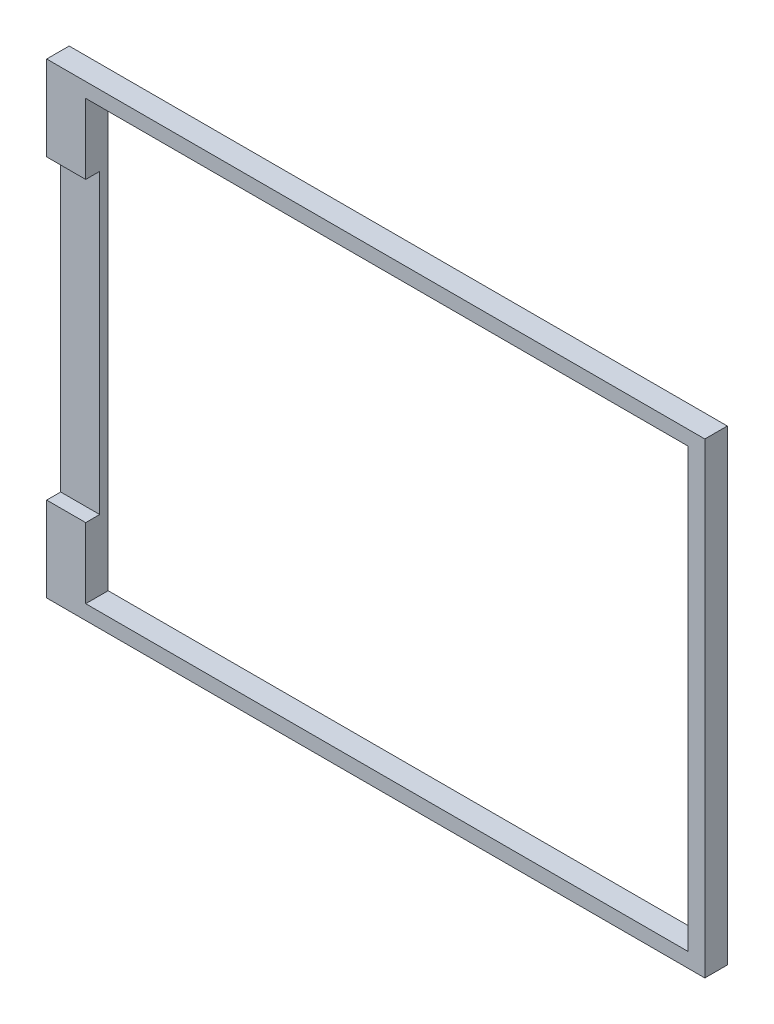
ISO-10303-21;
HEADER;
FILE_DESCRIPTION(('STEP AP214'),'2;1');
FILE_NAME('part.step','',(''),(''),'','','');
FILE_SCHEMA(('AUTOMOTIVE_DESIGN { 1 0 10303 214 1 1 1 1 }'));
ENDSEC;
DATA;
#1=APPLICATION_CONTEXT('core data for automotive mechanical design processes');
#2=APPLICATION_PROTOCOL_DEFINITION('international standard','automotive_design',2000,#1);
#3=PRODUCT_CONTEXT('',#1,'mechanical');
#4=PRODUCT('Part','Part','',(#3));
#5=PRODUCT_RELATED_PRODUCT_CATEGORY('part','',(#4));
#6=PRODUCT_DEFINITION_FORMATION('','',#4);
#7=PRODUCT_DEFINITION_CONTEXT('part definition',#1,'design');
#8=PRODUCT_DEFINITION('design','',#6,#7);
#9=PRODUCT_DEFINITION_SHAPE('','',#8);
#10=(LENGTH_UNIT() NAMED_UNIT(*) SI_UNIT(.MILLI.,.METRE.));
#11=(NAMED_UNIT(*) PLANE_ANGLE_UNIT() SI_UNIT($,.RADIAN.));
#12=(NAMED_UNIT(*) SI_UNIT($,.STERADIAN.) SOLID_ANGLE_UNIT());
#13=UNCERTAINTY_MEASURE_WITH_UNIT(LENGTH_MEASURE(1.E-05),#10,'distance_accuracy_value','');
#14=(GEOMETRIC_REPRESENTATION_CONTEXT(3) GLOBAL_UNCERTAINTY_ASSIGNED_CONTEXT((#13)) GLOBAL_UNIT_ASSIGNED_CONTEXT((#10,
#11,#12)) REPRESENTATION_CONTEXT('',''));
#15=CARTESIAN_POINT('',(0.,0.,0.));
#16=DIRECTION('',(0.,0.,1.));
#17=DIRECTION('',(1.,0.,0.));
#18=AXIS2_PLACEMENT_3D('',#15,#16,#17);
#19=CARTESIAN_POINT('',(-38.8,17.52,-7.35));
#20=DIRECTION('',(0.,1.,0.));
#21=DIRECTION('',(-1.,0.,0.));
#22=AXIS2_PLACEMENT_3D('',#19,#20,#21);
#23=PLANE('',#22);
#24=DIRECTION('',(0.,0.,1.));
#25=VECTOR('',#24,1.);
#26=CARTESIAN_POINT('',(-34.2,17.52,-7.35));
#27=LINE('',#26,#25);
#28=CARTESIAN_POINT('',(-34.2,17.52,2.65));
#29=VERTEX_POINT('',#28);
#30=CARTESIAN_POINT('',(-34.2,17.52,0.999999999999999));
#31=VERTEX_POINT('',#30);
#32=EDGE_CURVE('E146',#29,#31,#27,.F.);
#33=ORIENTED_EDGE('',*,*,#32,.F.);
#34=DIRECTION('',(1.,0.,0.));
#35=VECTOR('',#34,1.);
#36=CARTESIAN_POINT('',(0.,17.52,2.65));
#37=LINE('',#36,#35);
#38=CARTESIAN_POINT('',(-38.8,17.52,2.65));
#39=VERTEX_POINT('',#38);
#40=EDGE_CURVE('E134',#39,#29,#37,.T.);
#41=ORIENTED_EDGE('',*,*,#40,.F.);
#42=DIRECTION('',(0.,0.,1.));
#43=VECTOR('',#42,1.);
#44=CARTESIAN_POINT('',(-38.8,17.52,-7.35));
#45=LINE('',#44,#43);
#46=CARTESIAN_POINT('',(-38.8,17.52,0.999999999999999));
#47=VERTEX_POINT('',#46);
#48=EDGE_CURVE('E19',#47,#39,#45,.T.);
#49=ORIENTED_EDGE('',*,*,#48,.F.);
#50=DIRECTION('',(-1.,0.,0.));
#51=VECTOR('',#50,1.);
#52=CARTESIAN_POINT('',(-38.8,17.52,1.));
#53=LINE('',#52,#51);
#54=EDGE_CURVE('E140',#47,#31,#53,.F.);
#55=ORIENTED_EDGE('',*,*,#54,.T.);
#56=EDGE_LOOP('',(#33,#41,#49,#55));
#57=FACE_BOUND('',#56,.T.);
#58=ADVANCED_FACE('F16',(#57),#23,.F.);
#59=CARTESIAN_POINT('',(-34.2,-17.52,-7.35));
#60=DIRECTION('',(0.,-1.,0.));
#61=DIRECTION('',(0.,0.,-1.));
#62=AXIS2_PLACEMENT_3D('',#59,#60,#61);
#63=PLANE('',#62);
#64=DIRECTION('',(0.,0.,-1.));
#65=VECTOR('',#64,1.);
#66=CARTESIAN_POINT('',(-38.8,-17.52,-7.35));
#67=LINE('',#66,#65);
#68=CARTESIAN_POINT('',(-38.8,-17.52,2.65));
#69=VERTEX_POINT('',#68);
#70=CARTESIAN_POINT('',(-38.8,-17.52,0.999999999999999));
#71=VERTEX_POINT('',#70);
#72=EDGE_CURVE('E143',#69,#71,#67,.T.);
#73=ORIENTED_EDGE('',*,*,#72,.F.);
#74=DIRECTION('',(1.,0.,0.));
#75=VECTOR('',#74,1.);
#76=CARTESIAN_POINT('',(0.,-17.52,2.65));
#77=LINE('',#76,#75);
#78=CARTESIAN_POINT('',(-34.2,-17.52,2.65));
#79=VERTEX_POINT('',#78);
#80=EDGE_CURVE('E122',#79,#69,#77,.F.);
#81=ORIENTED_EDGE('',*,*,#80,.F.);
#82=DIRECTION('',(0.,0.,-1.));
#83=VECTOR('',#82,1.);
#84=CARTESIAN_POINT('',(-34.2000000000001,-17.52,-7.35));
#85=LINE('',#84,#83);
#86=CARTESIAN_POINT('',(-34.2,-17.52,0.999999999999999));
#87=VERTEX_POINT('',#86);
#88=EDGE_CURVE('E145',#87,#79,#85,.F.);
#89=ORIENTED_EDGE('',*,*,#88,.F.);
#90=DIRECTION('',(-1.,0.,0.));
#91=VECTOR('',#90,1.);
#92=CARTESIAN_POINT('',(-38.8,-17.52,1.));
#93=LINE('',#92,#91);
#94=EDGE_CURVE('E137',#87,#71,#93,.T.);
#95=ORIENTED_EDGE('',*,*,#94,.T.);
#96=EDGE_LOOP('',(#73,#81,#89,#95));
#97=FACE_BOUND('',#96,.T.);
#98=ADVANCED_FACE('F251',(#97),#63,.F.);
#99=CARTESIAN_POINT('',(-38.8,-22.2274409183759,1.));
#100=DIRECTION('',(0.,0.,-1.));
#101=DIRECTION('',(-1.,0.,0.));
#102=AXIS2_PLACEMENT_3D('',#99,#100,#101);
#103=PLANE('',#102);
#104=DIRECTION('',(0.,1.,0.));
#105=VECTOR('',#104,1.);
#106=CARTESIAN_POINT('',(-34.2,17.52,0.999999999999999));
#107=LINE('',#106,#105);
#108=EDGE_CURVE('E181',#87,#31,#107,.T.);
#109=ORIENTED_EDGE('',*,*,#108,.T.);
#110=ORIENTED_EDGE('',*,*,#54,.F.);
#111=DIRECTION('',(0.,1.,0.));
#112=VECTOR('',#111,1.);
#113=CARTESIAN_POINT('',(-38.8,-74.141102220414,0.999999999999999));
#114=LINE('',#113,#112);
#115=EDGE_CURVE('E155',#47,#71,#114,.F.);
#116=ORIENTED_EDGE('',*,*,#115,.T.);
#117=ORIENTED_EDGE('',*,*,#94,.F.);
#118=EDGE_LOOP('',(#109,#110,#116,#117));
#119=FACE_BOUND('',#118,.T.);
#120=ADVANCED_FACE('F249',(#119),#103,.F.);
#121=CARTESIAN_POINT('',(0.,-74.141102220414,2.65));
#122=DIRECTION('',(0.,0.,1.));
#123=DIRECTION('',(1.,0.,0.));
#124=AXIS2_PLACEMENT_3D('',#121,#122,#123);
#125=PLANE('',#124);
#126=DIRECTION('',(1.,0.,0.));
#127=VECTOR('',#126,1.);
#128=CARTESIAN_POINT('',(0.,27.52,2.65));
#129=LINE('',#128,#127);
#130=CARTESIAN_POINT('',(-38.8,27.52,2.65));
#131=VERTEX_POINT('',#130);
#132=CARTESIAN_POINT('',(38.8,27.52,2.65));
#133=VERTEX_POINT('',#132);
#134=EDGE_CURVE('E103',#131,#133,#129,.T.);
#135=ORIENTED_EDGE('',*,*,#134,.F.);
#136=DIRECTION('',(0.,1.,0.));
#137=VECTOR('',#136,1.);
#138=CARTESIAN_POINT('',(-38.8,-74.141102220414,2.65));
#139=LINE('',#138,#137);
#140=EDGE_CURVE('E128',#131,#39,#139,.F.);
#141=ORIENTED_EDGE('',*,*,#140,.T.);
#142=ORIENTED_EDGE('',*,*,#40,.T.);
#143=DIRECTION('',(0.,1.,0.));
#144=VECTOR('',#143,1.);
#145=CARTESIAN_POINT('',(-34.2,17.52,2.65));
#146=LINE('',#145,#144);
#147=CARTESIAN_POINT('',(-34.2,25.8,2.65));
#148=VERTEX_POINT('',#147);
#149=EDGE_CURVE('E184',#29,#148,#146,.T.);
#150=ORIENTED_EDGE('',*,*,#149,.T.);
#151=DIRECTION('',(1.,0.,0.));
#152=VECTOR('',#151,1.);
#153=CARTESIAN_POINT('',(-34.2,25.8,2.65));
#154=LINE('',#153,#152);
#155=CARTESIAN_POINT('',(36.8,25.8,2.65));
#156=VERTEX_POINT('',#155);
#157=EDGE_CURVE('E187',#148,#156,#154,.T.);
#158=ORIENTED_EDGE('',*,*,#157,.T.);
#159=DIRECTION('',(0.,1.,0.));
#160=VECTOR('',#159,1.);
#161=CARTESIAN_POINT('',(36.8,25.8,2.65));
#162=LINE('',#161,#160);
#163=CARTESIAN_POINT('',(36.8,-25.8,2.65));
#164=VERTEX_POINT('',#163);
#165=EDGE_CURVE('E168',#156,#164,#162,.F.);
#166=ORIENTED_EDGE('',*,*,#165,.T.);
#167=DIRECTION('',(1.,0.,0.));
#168=VECTOR('',#167,1.);
#169=CARTESIAN_POINT('',(36.8,-25.8,2.65));
#170=LINE('',#169,#168);
#171=CARTESIAN_POINT('',(-34.2,-25.8,2.65));
#172=VERTEX_POINT('',#171);
#173=EDGE_CURVE('E173',#164,#172,#170,.F.);
#174=ORIENTED_EDGE('',*,*,#173,.T.);
#175=DIRECTION('',(0.,1.,0.));
#176=VECTOR('',#175,1.);
#177=CARTESIAN_POINT('',(-34.2,17.52,2.65));
#178=LINE('',#177,#176);
#179=EDGE_CURVE('E178',#172,#79,#178,.T.);
#180=ORIENTED_EDGE('',*,*,#179,.T.);
#181=ORIENTED_EDGE('',*,*,#80,.T.);
#182=DIRECTION('',(0.,1.,0.));
#183=VECTOR('',#182,1.);
#184=CARTESIAN_POINT('',(-38.8,-74.141102220414,2.65));
#185=LINE('',#184,#183);
#186=CARTESIAN_POINT('',(-38.8,-27.52,2.65));
#187=VERTEX_POINT('',#186);
#188=EDGE_CURVE('E158',#69,#187,#185,.F.);
#189=ORIENTED_EDGE('',*,*,#188,.T.);
#190=DIRECTION('',(1.,0.,0.));
#191=VECTOR('',#190,1.);
#192=CARTESIAN_POINT('',(0.,-27.52,2.65));
#193=LINE('',#192,#191);
#194=CARTESIAN_POINT('',(38.8,-27.52,2.65));
#195=VERTEX_POINT('',#194);
#196=EDGE_CURVE('E118',#187,#195,#193,.T.);
#197=ORIENTED_EDGE('',*,*,#196,.T.);
#198=DIRECTION('',(0.,1.,0.));
#199=VECTOR('',#198,1.);
#200=CARTESIAN_POINT('',(38.8,-74.141102220414,2.65));
#201=LINE('',#200,#199);
#202=EDGE_CURVE('E113',#133,#195,#201,.F.);
#203=ORIENTED_EDGE('',*,*,#202,.F.);
#204=EDGE_LOOP('',(#135,#141,#142,#150,#158,#166,#174,#180,#181,#189,#197,#203));
#205=FACE_BOUND('',#204,.T.);
#206=ADVANCED_FACE('F116',(#205),#125,.T.);
#207=CARTESIAN_POINT('',(38.8,-74.141102220414,2.65));
#208=DIRECTION('',(1.,0.,0.));
#209=DIRECTION('',(0.,1.,0.));
#210=AXIS2_PLACEMENT_3D('',#207,#208,#209);
#211=PLANE('',#210);
#212=ORIENTED_EDGE('',*,*,#202,.T.);
#213=DIRECTION('',(0.,0.,1.));
#214=VECTOR('',#213,1.);
#215=CARTESIAN_POINT('',(38.8,-27.52,2.65));
#216=LINE('',#215,#214);
#217=CARTESIAN_POINT('',(38.8,-27.52,0.));
#218=VERTEX_POINT('',#217);
#219=EDGE_CURVE('E166',#195,#218,#216,.F.);
#220=ORIENTED_EDGE('',*,*,#219,.T.);
#221=DIRECTION('',(0.,1.,0.));
#222=VECTOR('',#221,1.);
#223=CARTESIAN_POINT('',(38.8,-74.141102220414,0.));
#224=LINE('',#223,#222);
#225=CARTESIAN_POINT('',(38.8,27.52,0.));
#226=VERTEX_POINT('',#225);
#227=EDGE_CURVE('E126',#218,#226,#224,.T.);
#228=ORIENTED_EDGE('',*,*,#227,.T.);
#229=DIRECTION('',(0.,0.,1.));
#230=VECTOR('',#229,1.);
#231=CARTESIAN_POINT('',(38.8,27.52,2.65));
#232=LINE('',#231,#230);
#233=EDGE_CURVE('E110',#133,#226,#232,.F.);
#234=ORIENTED_EDGE('',*,*,#233,.F.);
#235=EDGE_LOOP('',(#212,#220,#228,#234));
#236=FACE_BOUND('',#235,.T.);
#237=ADVANCED_FACE('F125',(#236),#211,.T.);
#238=CARTESIAN_POINT('',(0.,27.52,2.65));
#239=DIRECTION('',(0.,1.,0.));
#240=DIRECTION('',(0.,0.,1.));
#241=AXIS2_PLACEMENT_3D('',#238,#239,#240);
#242=PLANE('',#241);
#243=ORIENTED_EDGE('',*,*,#134,.T.);
#244=ORIENTED_EDGE('',*,*,#233,.T.);
#245=DIRECTION('',(1.,0.,0.));
#246=VECTOR('',#245,1.);
#247=CARTESIAN_POINT('',(0.,27.52,0.));
#248=LINE('',#247,#246);
#249=CARTESIAN_POINT('',(-38.8,27.52,0.));
#250=VERTEX_POINT('',#249);
#251=EDGE_CURVE('E194',#226,#250,#248,.F.);
#252=ORIENTED_EDGE('',*,*,#251,.T.);
#253=DIRECTION('',(0.,0.,1.));
#254=VECTOR('',#253,1.);
#255=CARTESIAN_POINT('',(-38.8,27.52,2.65));
#256=LINE('',#255,#254);
#257=EDGE_CURVE('E112',#250,#131,#256,.T.);
#258=ORIENTED_EDGE('',*,*,#257,.T.);
#259=EDGE_LOOP('',(#243,#244,#252,#258));
#260=FACE_BOUND('',#259,.T.);
#261=ADVANCED_FACE('F107',(#260),#242,.T.);
#262=CARTESIAN_POINT('',(-38.8,-74.141102220414,2.65));
#263=DIRECTION('',(1.,0.,0.));
#264=DIRECTION('',(0.,1.,0.));
#265=AXIS2_PLACEMENT_3D('',#262,#263,#264);
#266=PLANE('',#265);
#267=ORIENTED_EDGE('',*,*,#72,.T.);
#268=ORIENTED_EDGE('',*,*,#115,.F.);
#269=ORIENTED_EDGE('',*,*,#48,.T.);
#270=ORIENTED_EDGE('',*,*,#140,.F.);
#271=ORIENTED_EDGE('',*,*,#257,.F.);
#272=DIRECTION('',(0.,1.,0.));
#273=VECTOR('',#272,1.);
#274=CARTESIAN_POINT('',(-38.8,-74.141102220414,0.));
#275=LINE('',#274,#273);
#276=CARTESIAN_POINT('',(-38.8,-27.52,0.));
#277=VERTEX_POINT('',#276);
#278=EDGE_CURVE('E196',#250,#277,#275,.F.);
#279=ORIENTED_EDGE('',*,*,#278,.T.);
#280=DIRECTION('',(0.,0.,1.));
#281=VECTOR('',#280,1.);
#282=CARTESIAN_POINT('',(-38.8,-27.52,2.65));
#283=LINE('',#282,#281);
#284=EDGE_CURVE('E162',#277,#187,#283,.T.);
#285=ORIENTED_EDGE('',*,*,#284,.T.);
#286=ORIENTED_EDGE('',*,*,#188,.F.);
#287=EDGE_LOOP('',(#267,#268,#269,#270,#271,#279,#285,#286));
#288=FACE_BOUND('',#287,.T.);
#289=ADVANCED_FACE('F153',(#288),#266,.F.);
#290=CARTESIAN_POINT('',(0.,-27.52,2.65));
#291=DIRECTION('',(0.,1.,0.));
#292=DIRECTION('',(0.,0.,1.));
#293=AXIS2_PLACEMENT_3D('',#290,#291,#292);
#294=PLANE('',#293);
#295=ORIENTED_EDGE('',*,*,#219,.F.);
#296=ORIENTED_EDGE('',*,*,#196,.F.);
#297=ORIENTED_EDGE('',*,*,#284,.F.);
#298=DIRECTION('',(1.,0.,0.));
#299=VECTOR('',#298,1.);
#300=CARTESIAN_POINT('',(0.,-27.52,0.));
#301=LINE('',#300,#299);
#302=EDGE_CURVE('E199',#277,#218,#301,.T.);
#303=ORIENTED_EDGE('',*,*,#302,.T.);
#304=EDGE_LOOP('',(#295,#296,#297,#303));
#305=FACE_BOUND('',#304,.T.);
#306=ADVANCED_FACE('F237',(#305),#294,.F.);
#307=CARTESIAN_POINT('',(36.8,25.8,-7.35));
#308=DIRECTION('',(1.,0.,0.));
#309=DIRECTION('',(0.,1.,0.));
#310=AXIS2_PLACEMENT_3D('',#307,#308,#309);
#311=PLANE('',#310);
#312=ORIENTED_EDGE('',*,*,#165,.F.);
#313=DIRECTION('',(0.,0.,1.));
#314=VECTOR('',#313,1.);
#315=CARTESIAN_POINT('',(36.8,25.8,-7.35));
#316=LINE('',#315,#314);
#317=CARTESIAN_POINT('',(36.8,25.8,0.));
#318=VERTEX_POINT('',#317);
#319=EDGE_CURVE('E190',#156,#318,#316,.F.);
#320=ORIENTED_EDGE('',*,*,#319,.T.);
#321=DIRECTION('',(0.,1.,0.));
#322=VECTOR('',#321,1.);
#323=CARTESIAN_POINT('',(36.8,-74.141102220414,0.));
#324=LINE('',#323,#322);
#325=CARTESIAN_POINT('',(36.8,-25.8,0.));
#326=VERTEX_POINT('',#325);
#327=EDGE_CURVE('E202',#318,#326,#324,.F.);
#328=ORIENTED_EDGE('',*,*,#327,.T.);
#329=DIRECTION('',(0.,0.,1.));
#330=VECTOR('',#329,1.);
#331=CARTESIAN_POINT('',(36.8,-25.8,-7.35));
#332=LINE('',#331,#330);
#333=EDGE_CURVE('E170',#326,#164,#332,.T.);
#334=ORIENTED_EDGE('',*,*,#333,.T.);
#335=EDGE_LOOP('',(#312,#320,#328,#334));
#336=FACE_BOUND('',#335,.T.);
#337=ADVANCED_FACE('F220',(#336),#311,.F.);
#338=CARTESIAN_POINT('',(36.8,-25.8,-7.35));
#339=DIRECTION('',(0.,-1.,0.));
#340=DIRECTION('',(1.,0.,0.));
#341=AXIS2_PLACEMENT_3D('',#338,#339,#340);
#342=PLANE('',#341);
#343=ORIENTED_EDGE('',*,*,#173,.F.);
#344=ORIENTED_EDGE('',*,*,#333,.F.);
#345=DIRECTION('',(1.,0.,0.));
#346=VECTOR('',#345,1.);
#347=CARTESIAN_POINT('',(0.,-25.8,0.));
#348=LINE('',#347,#346);
#349=CARTESIAN_POINT('',(-34.2,-25.8,0.));
#350=VERTEX_POINT('',#349);
#351=EDGE_CURVE('E205',#326,#350,#348,.F.);
#352=ORIENTED_EDGE('',*,*,#351,.T.);
#353=DIRECTION('',(0.,0.,1.));
#354=VECTOR('',#353,1.);
#355=CARTESIAN_POINT('',(-34.2,-25.8,-7.35));
#356=LINE('',#355,#354);
#357=EDGE_CURVE('E175',#350,#172,#356,.T.);
#358=ORIENTED_EDGE('',*,*,#357,.T.);
#359=EDGE_LOOP('',(#343,#344,#352,#358));
#360=FACE_BOUND('',#359,.T.);
#361=ADVANCED_FACE('F218',(#360),#342,.F.);
#362=CARTESIAN_POINT('',(-34.2,17.52,-7.35));
#363=DIRECTION('',(-1.,0.,0.));
#364=DIRECTION('',(0.,0.,1.));
#365=AXIS2_PLACEMENT_3D('',#362,#363,#364);
#366=PLANE('',#365);
#367=ORIENTED_EDGE('',*,*,#149,.F.);
#368=ORIENTED_EDGE('',*,*,#32,.T.);
#369=ORIENTED_EDGE('',*,*,#108,.F.);
#370=ORIENTED_EDGE('',*,*,#88,.T.);
#371=ORIENTED_EDGE('',*,*,#179,.F.);
#372=ORIENTED_EDGE('',*,*,#357,.F.);
#373=DIRECTION('',(0.,1.,0.));
#374=VECTOR('',#373,1.);
#375=CARTESIAN_POINT('',(-34.2,-74.141102220414,0.));
#376=LINE('',#375,#374);
#377=CARTESIAN_POINT('',(-34.2,25.8,0.));
#378=VERTEX_POINT('',#377);
#379=EDGE_CURVE('E25',#350,#378,#376,.T.);
#380=ORIENTED_EDGE('',*,*,#379,.T.);
#381=DIRECTION('',(0.,0.,1.));
#382=VECTOR('',#381,1.);
#383=CARTESIAN_POINT('',(-34.2,25.8,-7.35));
#384=LINE('',#383,#382);
#385=EDGE_CURVE('E33',#378,#148,#384,.T.);
#386=ORIENTED_EDGE('',*,*,#385,.T.);
#387=EDGE_LOOP('',(#367,#368,#369,#370,#371,#372,#380,#386));
#388=FACE_BOUND('',#387,.T.);
#389=ADVANCED_FACE('F210',(#388),#366,.F.);
#390=CARTESIAN_POINT('',(-34.2,25.8,-7.35));
#391=DIRECTION('',(0.,1.,0.));
#392=DIRECTION('',(0.,0.,1.));
#393=AXIS2_PLACEMENT_3D('',#390,#391,#392);
#394=PLANE('',#393);
#395=ORIENTED_EDGE('',*,*,#157,.F.);
#396=ORIENTED_EDGE('',*,*,#385,.F.);
#397=DIRECTION('',(1.,0.,0.));
#398=VECTOR('',#397,1.);
#399=CARTESIAN_POINT('',(0.,25.8,0.));
#400=LINE('',#399,#398);
#401=EDGE_CURVE('E11',#378,#318,#400,.T.);
#402=ORIENTED_EDGE('',*,*,#401,.T.);
#403=ORIENTED_EDGE('',*,*,#319,.F.);
#404=EDGE_LOOP('',(#395,#396,#402,#403));
#405=FACE_BOUND('',#404,.T.);
#406=ADVANCED_FACE('F222',(#405),#394,.F.);
#407=CARTESIAN_POINT('',(0.,-74.141102220414,0.));
#408=DIRECTION('',(0.,0.,1.));
#409=DIRECTION('',(1.,0.,0.));
#410=AXIS2_PLACEMENT_3D('',#407,#408,#409);
#411=PLANE('',#410);
#412=ORIENTED_EDGE('',*,*,#379,.F.);
#413=ORIENTED_EDGE('',*,*,#351,.F.);
#414=ORIENTED_EDGE('',*,*,#327,.F.);
#415=ORIENTED_EDGE('',*,*,#401,.F.);
#416=EDGE_LOOP('',(#412,#413,#414,#415));
#417=FACE_BOUND('',#416,.T.);
#418=ORIENTED_EDGE('',*,*,#278,.F.);
#419=ORIENTED_EDGE('',*,*,#251,.F.);
#420=ORIENTED_EDGE('',*,*,#227,.F.);
#421=ORIENTED_EDGE('',*,*,#302,.F.);
#422=EDGE_LOOP('',(#418,#419,#420,#421));
#423=FACE_BOUND('',#422,.T.);
#424=ADVANCED_FACE('F214',(#417,#423),#411,.F.);
#425=CLOSED_SHELL('',(#58,#98,#120,#206,#237,#261,#289,#306,#337,#361,#389,#406,#424));
#426=MANIFOLD_SOLID_BREP('B1',#425);
#427=ADVANCED_BREP_SHAPE_REPRESENTATION('',(#18,#426),#14);
#428=SHAPE_DEFINITION_REPRESENTATION(#9,#427);
ENDSEC;
END-ISO-10303-21;
